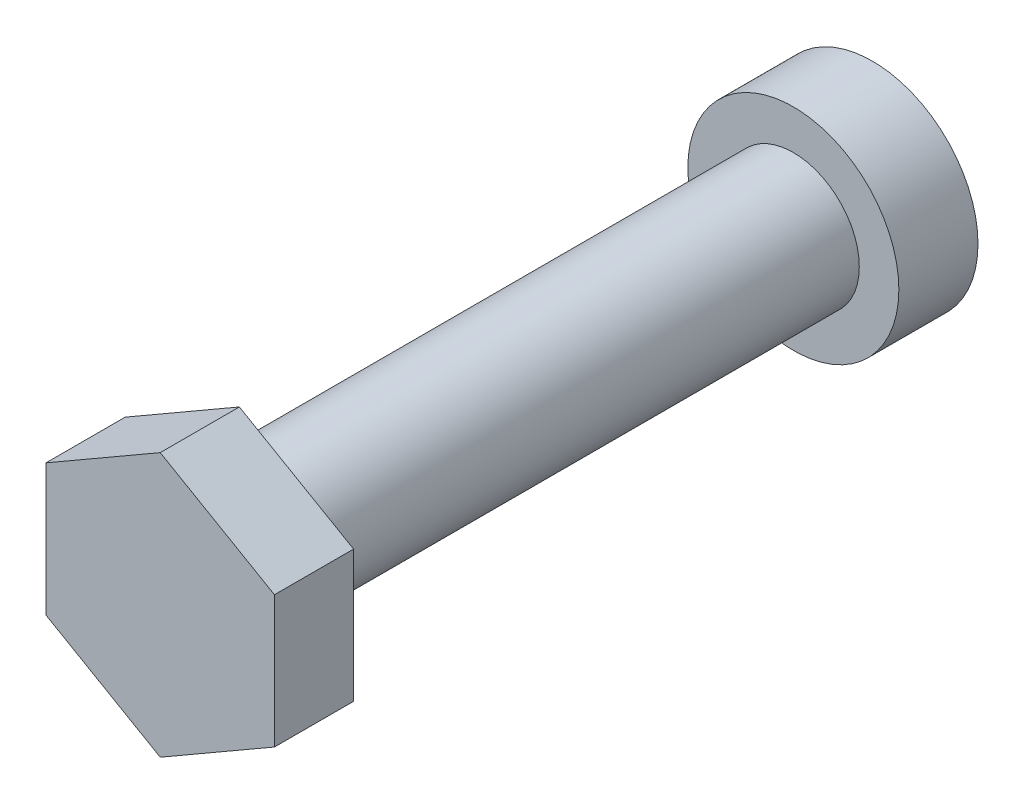
ISO-10303-21;
HEADER;
FILE_DESCRIPTION(('STEP AP214'),'2;1');
FILE_NAME('part.step','',(''),(''),'','','');
FILE_SCHEMA(('AUTOMOTIVE_DESIGN { 1 0 10303 214 1 1 1 1 }'));
ENDSEC;
DATA;
#1=APPLICATION_CONTEXT('core data for automotive mechanical design processes');
#2=APPLICATION_PROTOCOL_DEFINITION('international standard','automotive_design',2000,#1);
#3=PRODUCT_CONTEXT('',#1,'mechanical');
#4=PRODUCT('Part','Part','',(#3));
#5=PRODUCT_RELATED_PRODUCT_CATEGORY('part','',(#4));
#6=PRODUCT_DEFINITION_FORMATION('','',#4);
#7=PRODUCT_DEFINITION_CONTEXT('part definition',#1,'design');
#8=PRODUCT_DEFINITION('design','',#6,#7);
#9=PRODUCT_DEFINITION_SHAPE('','',#8);
#10=(LENGTH_UNIT() NAMED_UNIT(*) SI_UNIT(.MILLI.,.METRE.));
#11=(NAMED_UNIT(*) PLANE_ANGLE_UNIT() SI_UNIT($,.RADIAN.));
#12=(NAMED_UNIT(*) SI_UNIT($,.STERADIAN.) SOLID_ANGLE_UNIT());
#13=UNCERTAINTY_MEASURE_WITH_UNIT(LENGTH_MEASURE(1.E-05),#10,'distance_accuracy_value','');
#14=(GEOMETRIC_REPRESENTATION_CONTEXT(3) GLOBAL_UNCERTAINTY_ASSIGNED_CONTEXT((#13)) GLOBAL_UNIT_ASSIGNED_CONTEXT((#10,
#11,#12)) REPRESENTATION_CONTEXT('',''));
#15=CARTESIAN_POINT('',(0.,0.,0.));
#16=DIRECTION('',(0.,0.,1.));
#17=DIRECTION('',(1.,0.,0.));
#18=AXIS2_PLACEMENT_3D('',#15,#16,#17);
#19=CARTESIAN_POINT('',(0.,0.353270886840137,-21.));
#20=DIRECTION('',(0.,0.,-1.));
#21=DIRECTION('',(-1.,0.,0.));
#22=AXIS2_PLACEMENT_3D('',#19,#20,#21);
#23=CYLINDRICAL_SURFACE('',#22,4.);
#24=CARTESIAN_POINT('',(0.,0.353270886840137,-21.));
#25=DIRECTION('',(0.,0.,-1.));
#26=DIRECTION('',(-1.,0.,0.));
#27=AXIS2_PLACEMENT_3D('',#24,#25,#26);
#28=CIRCLE('',#27,4.);
#29=CARTESIAN_POINT('',(-4.,0.353270886840137,-21.));
#30=VERTEX_POINT('',#29);
#31=EDGE_CURVE('E11',#30,#30,#28,.T.);
#32=ORIENTED_EDGE('',*,*,#31,.T.);
#33=EDGE_LOOP('',(#32));
#34=FACE_BOUND('',#33,.T.);
#35=CARTESIAN_POINT('',(0.,0.353270886840137,-24.));
#36=DIRECTION('',(0.,0.,-1.));
#37=DIRECTION('',(-1.,0.,0.));
#38=AXIS2_PLACEMENT_3D('',#35,#36,#37);
#39=CIRCLE('',#38,4.);
#40=CARTESIAN_POINT('',(-4.,0.353270886840137,-24.));
#41=VERTEX_POINT('',#40);
#42=EDGE_CURVE('E47',#41,#41,#39,.T.);
#43=ORIENTED_EDGE('',*,*,#42,.F.);
#44=EDGE_LOOP('',(#43));
#45=FACE_BOUND('',#44,.T.);
#46=ADVANCED_FACE('F44',(#34,#45),#23,.T.);
#47=CARTESIAN_POINT('',(0.,0.353270886840137,-21.));
#48=DIRECTION('',(0.,0.,-1.));
#49=DIRECTION('',(-1.,0.,0.));
#50=AXIS2_PLACEMENT_3D('',#47,#48,#49);
#51=PLANE('',#50);
#52=ORIENTED_EDGE('',*,*,#31,.F.);
#53=EDGE_LOOP('',(#52));
#54=FACE_BOUND('',#53,.T.);
#55=ADVANCED_FACE('F59',(#54),#51,.F.);
#56=CARTESIAN_POINT('',(0.,0.353270886840137,-24.));
#57=DIRECTION('',(0.,0.,-1.));
#58=DIRECTION('',(-1.,0.,0.));
#59=AXIS2_PLACEMENT_3D('',#56,#57,#58);
#60=PLANE('',#59);
#61=ORIENTED_EDGE('',*,*,#42,.T.);
#62=EDGE_LOOP('',(#61));
#63=FACE_BOUND('',#62,.T.);
#64=ADVANCED_FACE('F56',(#63),#60,.T.);
#65=CLOSED_SHELL('',(#46,#55,#64));
#66=MANIFOLD_SOLID_BREP('B2',#65);
#67=CARTESIAN_POINT('',(0.,0.353270886840137,-24.));
#68=DIRECTION('',(0.,0.,1.));
#69=DIRECTION('',(1.,0.,0.));
#70=AXIS2_PLACEMENT_3D('',#67,#68,#69);
#71=CYLINDRICAL_SURFACE('',#70,2.5);
#72=CARTESIAN_POINT('',(0.,0.353270886840137,-24.));
#73=DIRECTION('',(0.,0.,1.));
#74=DIRECTION('',(1.,0.,0.));
#75=AXIS2_PLACEMENT_3D('',#72,#73,#74);
#76=CIRCLE('',#75,2.5);
#77=CARTESIAN_POINT('',(2.5,0.353270886840137,-24.));
#78=VERTEX_POINT('',#77);
#79=EDGE_CURVE('E42',#78,#78,#76,.T.);
#80=ORIENTED_EDGE('',*,*,#79,.T.);
#81=EDGE_LOOP('',(#80));
#82=FACE_BOUND('',#81,.T.);
#83=CARTESIAN_POINT('',(0.,0.353270886840137,0.));
#84=DIRECTION('',(0.,0.,1.));
#85=DIRECTION('',(1.,0.,0.));
#86=AXIS2_PLACEMENT_3D('',#83,#84,#85);
#87=CIRCLE('',#86,2.5);
#88=CARTESIAN_POINT('',(2.5,0.353270886840137,0.));
#89=VERTEX_POINT('',#88);
#90=EDGE_CURVE('E87',#89,#89,#87,.T.);
#91=ORIENTED_EDGE('',*,*,#90,.F.);
#92=EDGE_LOOP('',(#91));
#93=FACE_BOUND('',#92,.T.);
#94=ADVANCED_FACE('F84',(#82,#93),#71,.T.);
#95=CARTESIAN_POINT('',(0.,0.353270886840137,-24.));
#96=DIRECTION('',(0.,0.,1.));
#97=DIRECTION('',(1.,0.,0.));
#98=AXIS2_PLACEMENT_3D('',#95,#96,#97);
#99=PLANE('',#98);
#100=ORIENTED_EDGE('',*,*,#79,.F.);
#101=EDGE_LOOP('',(#100));
#102=FACE_BOUND('',#101,.T.);
#103=ADVANCED_FACE('F195',(#102),#99,.F.);
#104=CARTESIAN_POINT('',(0.,-5.,3.));
#105=DIRECTION('',(-0.5,0.866025403784438,0.));
#106=DIRECTION('',(-0.866025403784438,-0.5,0.));
#107=AXIS2_PLACEMENT_3D('',#104,#105,#106);
#108=PLANE('',#107);
#109=DIRECTION('',(0.866025403784438,0.5,0.));
#110=VECTOR('',#109,1.);
#111=CARTESIAN_POINT('',(0.,-5.,0.));
#112=LINE('',#111,#110);
#113=CARTESIAN_POINT('',(0.,-5.,0.));
#114=VERTEX_POINT('',#113);
#115=CARTESIAN_POINT('',(4.33012701892219,-2.5,0.));
#116=VERTEX_POINT('',#115);
#117=EDGE_CURVE('E169',#114,#116,#112,.T.);
#118=ORIENTED_EDGE('',*,*,#117,.T.);
#119=DIRECTION('',(0.,0.,-1.));
#120=VECTOR('',#119,1.);
#121=CARTESIAN_POINT('',(4.33012701892219,-2.5,3.));
#122=LINE('',#121,#120);
#123=CARTESIAN_POINT('',(4.33012701892219,-2.5,3.));
#124=VERTEX_POINT('',#123);
#125=EDGE_CURVE('E186',#124,#116,#122,.T.);
#126=ORIENTED_EDGE('',*,*,#125,.F.);
#127=DIRECTION('',(0.866025403784438,0.5,0.));
#128=VECTOR('',#127,1.);
#129=CARTESIAN_POINT('',(0.,-5.,3.));
#130=LINE('',#129,#128);
#131=CARTESIAN_POINT('',(0.,-5.,3.));
#132=VERTEX_POINT('',#131);
#133=EDGE_CURVE('E179',#132,#124,#130,.T.);
#134=ORIENTED_EDGE('',*,*,#133,.F.);
#135=DIRECTION('',(0.,0.,-1.));
#136=VECTOR('',#135,1.);
#137=CARTESIAN_POINT('',(0.,-5.,3.));
#138=LINE('',#137,#136);
#139=EDGE_CURVE('E165',#132,#114,#138,.T.);
#140=ORIENTED_EDGE('',*,*,#139,.T.);
#141=EDGE_LOOP('',(#118,#126,#134,#140));
#142=FACE_BOUND('',#141,.T.);
#143=ADVANCED_FACE('F200',(#142),#108,.F.);
#144=CARTESIAN_POINT('',(4.33012701892219,-2.5,3.));
#145=DIRECTION('',(-1.,0.,0.));
#146=DIRECTION('',(0.,-1.,0.));
#147=AXIS2_PLACEMENT_3D('',#144,#145,#146);
#148=PLANE('',#147);
#149=DIRECTION('',(0.,1.,0.));
#150=VECTOR('',#149,1.);
#151=CARTESIAN_POINT('',(4.33012701892219,-2.5,0.));
#152=LINE('',#151,#150);
#153=CARTESIAN_POINT('',(4.33012701892219,2.5,0.));
#154=VERTEX_POINT('',#153);
#155=EDGE_CURVE('E172',#116,#154,#152,.T.);
#156=ORIENTED_EDGE('',*,*,#155,.T.);
#157=DIRECTION('',(0.,0.,-1.));
#158=VECTOR('',#157,1.);
#159=CARTESIAN_POINT('',(4.33012701892219,2.5,3.));
#160=LINE('',#159,#158);
#161=CARTESIAN_POINT('',(4.33012701892219,2.5,3.));
#162=VERTEX_POINT('',#161);
#163=EDGE_CURVE('E183',#162,#154,#160,.T.);
#164=ORIENTED_EDGE('',*,*,#163,.F.);
#165=DIRECTION('',(0.,1.,0.));
#166=VECTOR('',#165,1.);
#167=CARTESIAN_POINT('',(4.33012701892219,-2.5,3.));
#168=LINE('',#167,#166);
#169=EDGE_CURVE('E138',#124,#162,#168,.T.);
#170=ORIENTED_EDGE('',*,*,#169,.F.);
#171=ORIENTED_EDGE('',*,*,#125,.T.);
#172=EDGE_LOOP('',(#156,#164,#170,#171));
#173=FACE_BOUND('',#172,.T.);
#174=ADVANCED_FACE('F206',(#173),#148,.F.);
#175=CARTESIAN_POINT('',(4.33012701892219,2.5,3.));
#176=DIRECTION('',(-0.5,-0.866025403784439,0.));
#177=DIRECTION('',(0.866025403784439,-0.5,0.));
#178=AXIS2_PLACEMENT_3D('',#175,#176,#177);
#179=PLANE('',#178);
#180=DIRECTION('',(-0.866025403784439,0.5,0.));
#181=VECTOR('',#180,1.);
#182=CARTESIAN_POINT('',(4.33012701892219,2.5,0.));
#183=LINE('',#182,#181);
#184=CARTESIAN_POINT('',(0.,5.,0.));
#185=VERTEX_POINT('',#184);
#186=EDGE_CURVE('E174',#154,#185,#183,.T.);
#187=ORIENTED_EDGE('',*,*,#186,.T.);
#188=DIRECTION('',(0.,0.,-1.));
#189=VECTOR('',#188,1.);
#190=CARTESIAN_POINT('',(0.,5.,3.));
#191=LINE('',#190,#189);
#192=CARTESIAN_POINT('',(0.,5.,3.));
#193=VERTEX_POINT('',#192);
#194=EDGE_CURVE('E160',#193,#185,#191,.T.);
#195=ORIENTED_EDGE('',*,*,#194,.F.);
#196=DIRECTION('',(-0.866025403784439,0.5,0.));
#197=VECTOR('',#196,1.);
#198=CARTESIAN_POINT('',(4.33012701892219,2.5,3.));
#199=LINE('',#198,#197);
#200=EDGE_CURVE('E151',#162,#193,#199,.T.);
#201=ORIENTED_EDGE('',*,*,#200,.F.);
#202=ORIENTED_EDGE('',*,*,#163,.T.);
#203=EDGE_LOOP('',(#187,#195,#201,#202));
#204=FACE_BOUND('',#203,.T.);
#205=ADVANCED_FACE('F212',(#204),#179,.F.);
#206=CARTESIAN_POINT('',(0.,5.,3.));
#207=DIRECTION('',(0.5,-0.866025403784438,0.));
#208=DIRECTION('',(0.866025403784439,0.5,0.));
#209=AXIS2_PLACEMENT_3D('',#206,#207,#208);
#210=PLANE('',#209);
#211=DIRECTION('',(-0.866025403784439,-0.5,0.));
#212=VECTOR('',#211,1.);
#213=CARTESIAN_POINT('',(0.,5.,0.));
#214=LINE('',#213,#212);
#215=CARTESIAN_POINT('',(-4.33012701892219,2.5,0.));
#216=VERTEX_POINT('',#215);
#217=EDGE_CURVE('E159',#185,#216,#214,.T.);
#218=ORIENTED_EDGE('',*,*,#217,.T.);
#219=DIRECTION('',(0.,0.,-1.));
#220=VECTOR('',#219,1.);
#221=CARTESIAN_POINT('',(-4.33012701892219,2.5,3.));
#222=LINE('',#221,#220);
#223=CARTESIAN_POINT('',(-4.33012701892219,2.5,3.));
#224=VERTEX_POINT('',#223);
#225=EDGE_CURVE('E156',#224,#216,#222,.T.);
#226=ORIENTED_EDGE('',*,*,#225,.F.);
#227=DIRECTION('',(-0.866025403784439,-0.5,0.));
#228=VECTOR('',#227,1.);
#229=CARTESIAN_POINT('',(0.,5.,3.));
#230=LINE('',#229,#228);
#231=EDGE_CURVE('E145',#193,#224,#230,.T.);
#232=ORIENTED_EDGE('',*,*,#231,.F.);
#233=ORIENTED_EDGE('',*,*,#194,.T.);
#234=EDGE_LOOP('',(#218,#226,#232,#233));
#235=FACE_BOUND('',#234,.T.);
#236=ADVANCED_FACE('F157',(#235),#210,.F.);
#237=CARTESIAN_POINT('',(-4.33012701892219,2.5,3.));
#238=DIRECTION('',(1.,0.,0.));
#239=DIRECTION('',(0.,0.,-1.));
#240=AXIS2_PLACEMENT_3D('',#237,#238,#239);
#241=PLANE('',#240);
#242=DIRECTION('',(0.,-1.,0.));
#243=VECTOR('',#242,1.);
#244=CARTESIAN_POINT('',(-4.33012701892219,2.5,0.));
#245=LINE('',#244,#243);
#246=CARTESIAN_POINT('',(-4.33012701892219,-2.5,0.));
#247=VERTEX_POINT('',#246);
#248=EDGE_CURVE('E123',#216,#247,#245,.T.);
#249=ORIENTED_EDGE('',*,*,#248,.T.);
#250=DIRECTION('',(0.,0.,-1.));
#251=VECTOR('',#250,1.);
#252=CARTESIAN_POINT('',(-4.33012701892219,-2.5,3.));
#253=LINE('',#252,#251);
#254=CARTESIAN_POINT('',(-4.33012701892219,-2.5,3.));
#255=VERTEX_POINT('',#254);
#256=EDGE_CURVE('E161',#255,#247,#253,.T.);
#257=ORIENTED_EDGE('',*,*,#256,.F.);
#258=DIRECTION('',(0.,-1.,0.));
#259=VECTOR('',#258,1.);
#260=CARTESIAN_POINT('',(-4.33012701892219,2.5,3.));
#261=LINE('',#260,#259);
#262=EDGE_CURVE('E149',#224,#255,#261,.T.);
#263=ORIENTED_EDGE('',*,*,#262,.F.);
#264=ORIENTED_EDGE('',*,*,#225,.T.);
#265=EDGE_LOOP('',(#249,#257,#263,#264));
#266=FACE_BOUND('',#265,.T.);
#267=ADVANCED_FACE('F163',(#266),#241,.F.);
#268=CARTESIAN_POINT('',(-4.33012701892219,-2.5,3.));
#269=DIRECTION('',(0.5,0.866025403784439,0.));
#270=DIRECTION('',(-0.866025403784439,0.5,0.));
#271=AXIS2_PLACEMENT_3D('',#268,#269,#270);
#272=PLANE('',#271);
#273=DIRECTION('',(0.866025403784439,-0.5,0.));
#274=VECTOR('',#273,1.);
#275=CARTESIAN_POINT('',(-4.33012701892219,-2.5,0.));
#276=LINE('',#275,#274);
#277=EDGE_CURVE('E129',#247,#114,#276,.T.);
#278=ORIENTED_EDGE('',*,*,#277,.T.);
#279=ORIENTED_EDGE('',*,*,#139,.F.);
#280=DIRECTION('',(0.866025403784439,-0.5,0.));
#281=VECTOR('',#280,1.);
#282=CARTESIAN_POINT('',(-4.33012701892219,-2.5,3.));
#283=LINE('',#282,#281);
#284=EDGE_CURVE('E100',#255,#132,#283,.T.);
#285=ORIENTED_EDGE('',*,*,#284,.F.);
#286=ORIENTED_EDGE('',*,*,#256,.T.);
#287=EDGE_LOOP('',(#278,#279,#285,#286));
#288=FACE_BOUND('',#287,.T.);
#289=ADVANCED_FACE('F220',(#288),#272,.F.);
#290=CARTESIAN_POINT('',(0.,0.,3.));
#291=DIRECTION('',(0.,0.,1.));
#292=DIRECTION('',(1.,0.,0.));
#293=AXIS2_PLACEMENT_3D('',#290,#291,#292);
#294=PLANE('',#293);
#295=ORIENTED_EDGE('',*,*,#133,.T.);
#296=ORIENTED_EDGE('',*,*,#169,.T.);
#297=ORIENTED_EDGE('',*,*,#200,.T.);
#298=ORIENTED_EDGE('',*,*,#231,.T.);
#299=ORIENTED_EDGE('',*,*,#262,.T.);
#300=ORIENTED_EDGE('',*,*,#284,.T.);
#301=EDGE_LOOP('',(#295,#296,#297,#298,#299,#300));
#302=FACE_BOUND('',#301,.T.);
#303=ADVANCED_FACE('F147',(#302),#294,.T.);
#304=CARTESIAN_POINT('',(0.,0.,0.));
#305=DIRECTION('',(0.,0.,1.));
#306=DIRECTION('',(1.,0.,0.));
#307=AXIS2_PLACEMENT_3D('',#304,#305,#306);
#308=PLANE('',#307);
#309=ORIENTED_EDGE('',*,*,#90,.T.);
#310=EDGE_LOOP('',(#309));
#311=FACE_BOUND('',#310,.T.);
#312=ORIENTED_EDGE('',*,*,#117,.F.);
#313=ORIENTED_EDGE('',*,*,#277,.F.);
#314=ORIENTED_EDGE('',*,*,#248,.F.);
#315=ORIENTED_EDGE('',*,*,#217,.F.);
#316=ORIENTED_EDGE('',*,*,#186,.F.);
#317=ORIENTED_EDGE('',*,*,#155,.F.);
#318=EDGE_LOOP('',(#312,#313,#314,#315,#316,#317));
#319=FACE_BOUND('',#318,.T.);
#320=ADVANCED_FACE('F191',(#311,#319),#308,.F.);
#321=CLOSED_SHELL('',(#94,#103,#143,#174,#205,#236,#267,#289,#303,#320));
#322=MANIFOLD_SOLID_BREP('B6',#321);
#323=ADVANCED_BREP_SHAPE_REPRESENTATION('',(#18,#66,#322),#14);
#324=SHAPE_DEFINITION_REPRESENTATION(#9,#323);
ENDSEC;
END-ISO-10303-21;
